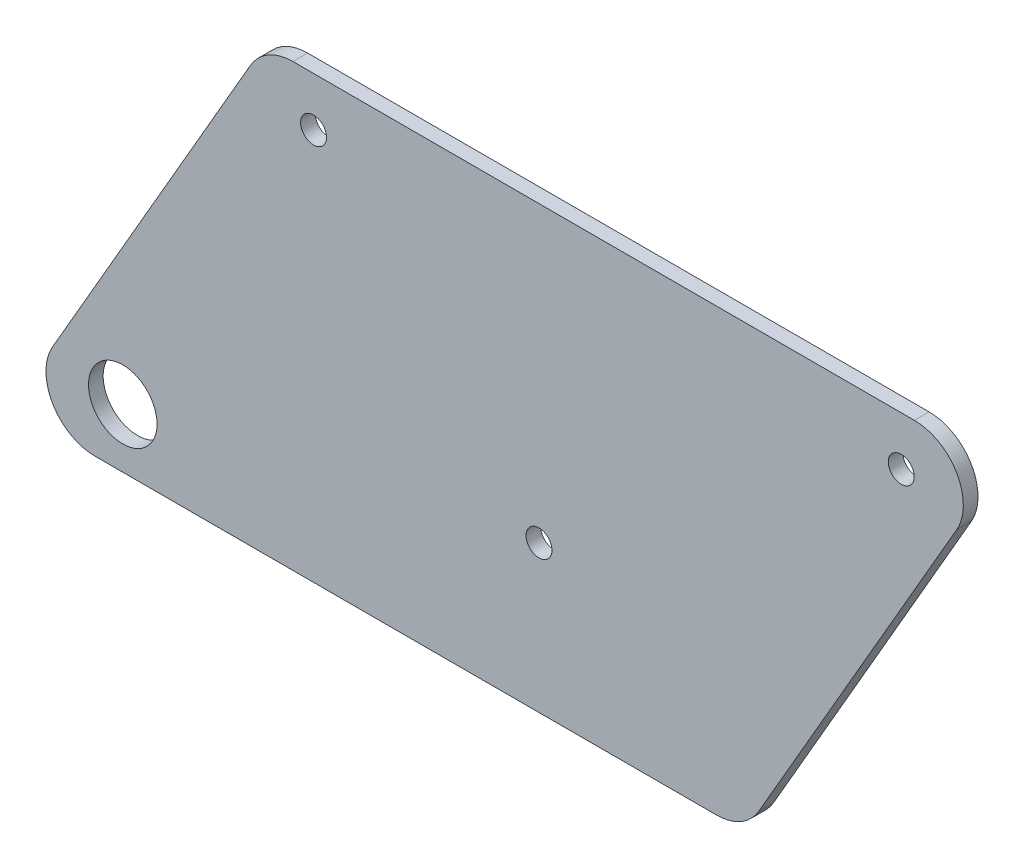
ISO-10303-21;
HEADER;
FILE_DESCRIPTION(('STEP AP214'),'2;1');
FILE_NAME('part.step','',(''),(''),'','','');
FILE_SCHEMA(('AUTOMOTIVE_DESIGN { 1 0 10303 214 1 1 1 1 }'));
ENDSEC;
DATA;
#1=APPLICATION_CONTEXT('core data for automotive mechanical design processes');
#2=APPLICATION_PROTOCOL_DEFINITION('international standard','automotive_design',2000,#1);
#3=PRODUCT_CONTEXT('',#1,'mechanical');
#4=PRODUCT('Part','Part','',(#3));
#5=PRODUCT_RELATED_PRODUCT_CATEGORY('part','',(#4));
#6=PRODUCT_DEFINITION_FORMATION('','',#4);
#7=PRODUCT_DEFINITION_CONTEXT('part definition',#1,'design');
#8=PRODUCT_DEFINITION('design','',#6,#7);
#9=PRODUCT_DEFINITION_SHAPE('','',#8);
#10=(LENGTH_UNIT() NAMED_UNIT(*) SI_UNIT(.MILLI.,.METRE.));
#11=(NAMED_UNIT(*) PLANE_ANGLE_UNIT() SI_UNIT($,.RADIAN.));
#12=(NAMED_UNIT(*) SI_UNIT($,.STERADIAN.) SOLID_ANGLE_UNIT());
#13=UNCERTAINTY_MEASURE_WITH_UNIT(LENGTH_MEASURE(1.E-05),#10,'distance_accuracy_value','');
#14=(GEOMETRIC_REPRESENTATION_CONTEXT(3) GLOBAL_UNCERTAINTY_ASSIGNED_CONTEXT((#13)) GLOBAL_UNIT_ASSIGNED_CONTEXT((#10,
#11,#12)) REPRESENTATION_CONTEXT('',''));
#15=CARTESIAN_POINT('',(0.,0.,0.));
#16=DIRECTION('',(0.,0.,1.));
#17=DIRECTION('',(1.,0.,0.));
#18=AXIS2_PLACEMENT_3D('',#15,#16,#17);
#19=CARTESIAN_POINT('',(150.,0.,3.));
#20=DIRECTION('',(0.,1.,0.));
#21=DIRECTION('',(0.,0.,1.));
#22=AXIS2_PLACEMENT_3D('',#19,#20,#21);
#23=PLANE('',#22);
#24=DIRECTION('',(1.,0.,0.));
#25=VECTOR('',#24,1.);
#26=CARTESIAN_POINT('',(150.,0.,0.));
#27=LINE('',#26,#25);
#28=CARTESIAN_POINT('',(17.3205080756889,0.,0.));
#29=VERTEX_POINT('',#28);
#30=CARTESIAN_POINT('',(144.226497308104,0.,0.));
#31=VERTEX_POINT('',#30);
#32=EDGE_CURVE('E137',#29,#31,#27,.T.);
#33=ORIENTED_EDGE('',*,*,#32,.T.);
#34=DIRECTION('',(0.,0.,-1.));
#35=VECTOR('',#34,1.);
#36=CARTESIAN_POINT('',(144.226497308104,0.,3.));
#37=LINE('',#36,#35);
#38=CARTESIAN_POINT('',(144.226497308104,0.,3.));
#39=VERTEX_POINT('',#38);
#40=EDGE_CURVE('E115',#31,#39,#37,.F.);
#41=ORIENTED_EDGE('',*,*,#40,.T.);
#42=DIRECTION('',(1.,0.,0.));
#43=VECTOR('',#42,1.);
#44=CARTESIAN_POINT('',(150.,0.,3.));
#45=LINE('',#44,#43);
#46=CARTESIAN_POINT('',(17.3205080756889,0.,3.));
#47=VERTEX_POINT('',#46);
#48=EDGE_CURVE('E147',#47,#39,#45,.T.);
#49=ORIENTED_EDGE('',*,*,#48,.F.);
#50=DIRECTION('',(0.,0.,-1.));
#51=VECTOR('',#50,1.);
#52=CARTESIAN_POINT('',(17.3205080756889,0.,3.));
#53=LINE('',#52,#51);
#54=EDGE_CURVE('E120',#47,#29,#53,.T.);
#55=ORIENTED_EDGE('',*,*,#54,.T.);
#56=EDGE_LOOP('',(#33,#41,#49,#55));
#57=FACE_BOUND('',#56,.T.);
#58=ADVANCED_FACE('F44',(#57),#23,.F.);
#59=CARTESIAN_POINT('',(201.961524227067,90.,3.));
#60=DIRECTION('',(-0.866025403784437,0.500000000000004,0.));
#61=DIRECTION('',(-0.500000000000004,-0.866025403784437,0.));
#62=AXIS2_PLACEMENT_3D('',#59,#60,#61);
#63=PLANE('',#62);
#64=DIRECTION('',(0.500000000000004,0.866025403784437,0.));
#65=VECTOR('',#64,1.);
#66=CARTESIAN_POINT('',(201.961524227067,90.,3.));
#67=LINE('',#66,#65);
#68=CARTESIAN_POINT('',(152.886751345948,4.99999999999996,3.));
#69=VERTEX_POINT('',#68);
#70=CARTESIAN_POINT('',(193.301270189222,75.,3.));
#71=VERTEX_POINT('',#70);
#72=EDGE_CURVE('E130',#69,#71,#67,.T.);
#73=ORIENTED_EDGE('',*,*,#72,.F.);
#74=DIRECTION('',(0.,0.,-1.));
#75=VECTOR('',#74,1.);
#76=CARTESIAN_POINT('',(152.886751345948,4.99999999999996,3.));
#77=LINE('',#76,#75);
#78=CARTESIAN_POINT('',(152.886751345948,4.99999999999996,0.));
#79=VERTEX_POINT('',#78);
#80=EDGE_CURVE('E114',#69,#79,#77,.T.);
#81=ORIENTED_EDGE('',*,*,#80,.T.);
#82=DIRECTION('',(0.500000000000004,0.866025403784437,0.));
#83=VECTOR('',#82,1.);
#84=CARTESIAN_POINT('',(201.961524227067,90.,0.));
#85=LINE('',#84,#83);
#86=CARTESIAN_POINT('',(193.301270189222,75.,0.));
#87=VERTEX_POINT('',#86);
#88=EDGE_CURVE('E127',#79,#87,#85,.T.);
#89=ORIENTED_EDGE('',*,*,#88,.T.);
#90=DIRECTION('',(0.,0.,-1.));
#91=VECTOR('',#90,1.);
#92=CARTESIAN_POINT('',(193.301270189222,75.,3.));
#93=LINE('',#92,#91);
#94=EDGE_CURVE('E132',#87,#71,#93,.F.);
#95=ORIENTED_EDGE('',*,*,#94,.T.);
#96=EDGE_LOOP('',(#73,#81,#89,#95));
#97=FACE_BOUND('',#96,.T.);
#98=ADVANCED_FACE('F126',(#97),#63,.F.);
#99=CARTESIAN_POINT('',(51.9615242270668,90.,3.));
#100=DIRECTION('',(0.,-1.,0.));
#101=DIRECTION('',(1.,0.,0.));
#102=AXIS2_PLACEMENT_3D('',#99,#100,#101);
#103=PLANE('',#102);
#104=DIRECTION('',(-1.,0.,0.));
#105=VECTOR('',#104,1.);
#106=CARTESIAN_POINT('',(51.9615242270668,90.,3.));
#107=LINE('',#106,#105);
#108=CARTESIAN_POINT('',(184.641016151378,90.,3.));
#109=VERTEX_POINT('',#108);
#110=CARTESIAN_POINT('',(57.7350269189631,90.,3.));
#111=VERTEX_POINT('',#110);
#112=EDGE_CURVE('E173',#109,#111,#107,.T.);
#113=ORIENTED_EDGE('',*,*,#112,.F.);
#114=DIRECTION('',(0.,0.,-1.));
#115=VECTOR('',#114,1.);
#116=CARTESIAN_POINT('',(184.641016151378,90.,3.));
#117=LINE('',#116,#115);
#118=CARTESIAN_POINT('',(184.641016151378,90.,0.));
#119=VERTEX_POINT('',#118);
#120=EDGE_CURVE('E166',#109,#119,#117,.T.);
#121=ORIENTED_EDGE('',*,*,#120,.T.);
#122=DIRECTION('',(-1.,0.,0.));
#123=VECTOR('',#122,1.);
#124=CARTESIAN_POINT('',(51.9615242270668,90.,0.));
#125=LINE('',#124,#123);
#126=CARTESIAN_POINT('',(57.7350269189631,90.,0.));
#127=VERTEX_POINT('',#126);
#128=EDGE_CURVE('E136',#119,#127,#125,.T.);
#129=ORIENTED_EDGE('',*,*,#128,.T.);
#130=DIRECTION('',(0.,0.,-1.));
#131=VECTOR('',#130,1.);
#132=CARTESIAN_POINT('',(57.7350269189631,90.,3.));
#133=LINE('',#132,#131);
#134=EDGE_CURVE('E164',#127,#111,#133,.F.);
#135=ORIENTED_EDGE('',*,*,#134,.T.);
#136=EDGE_LOOP('',(#113,#121,#129,#135));
#137=FACE_BOUND('',#136,.T.);
#138=ADVANCED_FACE('F171',(#137),#103,.F.);
#139=CARTESIAN_POINT('',(0.,0.,3.));
#140=DIRECTION('',(0.866025403784436,-0.500000000000004,0.));
#141=DIRECTION('',(0.500000000000004,0.866025403784436,0.));
#142=AXIS2_PLACEMENT_3D('',#139,#140,#141);
#143=PLANE('',#142);
#144=DIRECTION('',(-0.500000000000004,-0.866025403784436,0.));
#145=VECTOR('',#144,1.);
#146=CARTESIAN_POINT('',(0.,0.,3.));
#147=LINE('',#146,#145);
#148=CARTESIAN_POINT('',(49.0747728811187,85.,3.));
#149=VERTEX_POINT('',#148);
#150=CARTESIAN_POINT('',(8.6602540378445,15.,3.));
#151=VERTEX_POINT('',#150);
#152=EDGE_CURVE('E148',#149,#151,#147,.T.);
#153=ORIENTED_EDGE('',*,*,#152,.F.);
#154=DIRECTION('',(0.,0.,-1.));
#155=VECTOR('',#154,1.);
#156=CARTESIAN_POINT('',(49.0747728811187,85.,3.));
#157=LINE('',#156,#155);
#158=CARTESIAN_POINT('',(49.0747728811187,85.,0.));
#159=VERTEX_POINT('',#158);
#160=EDGE_CURVE('E11',#149,#159,#157,.T.);
#161=ORIENTED_EDGE('',*,*,#160,.T.);
#162=DIRECTION('',(-0.500000000000004,-0.866025403784436,0.));
#163=VECTOR('',#162,1.);
#164=CARTESIAN_POINT('',(0.,0.,0.));
#165=LINE('',#164,#163);
#166=CARTESIAN_POINT('',(8.6602540378445,15.,0.));
#167=VERTEX_POINT('',#166);
#168=EDGE_CURVE('E140',#159,#167,#165,.T.);
#169=ORIENTED_EDGE('',*,*,#168,.T.);
#170=DIRECTION('',(0.,0.,-1.));
#171=VECTOR('',#170,1.);
#172=CARTESIAN_POINT('',(8.6602540378445,15.,3.));
#173=LINE('',#172,#171);
#174=EDGE_CURVE('E52',#167,#151,#173,.F.);
#175=ORIENTED_EDGE('',*,*,#174,.T.);
#176=EDGE_LOOP('',(#153,#161,#169,#175));
#177=FACE_BOUND('',#176,.T.);
#178=ADVANCED_FACE('F180',(#177),#143,.F.);
#179=CARTESIAN_POINT('',(0.,0.,3.));
#180=DIRECTION('',(0.,0.,-1.));
#181=DIRECTION('',(-1.,0.,0.));
#182=AXIS2_PLACEMENT_3D('',#179,#180,#181);
#183=PLANE('',#182);
#184=CARTESIAN_POINT('',(23.,12.,3.));
#185=DIRECTION('',(0.,0.,1.));
#186=DIRECTION('',(1.,0.,0.));
#187=AXIS2_PLACEMENT_3D('',#184,#185,#186);
#188=CIRCLE('',#187,7.00000000000001);
#189=CARTESIAN_POINT('',(30.,12.,3.));
#190=VERTEX_POINT('',#189);
#191=EDGE_CURVE('E205',#190,#190,#188,.T.);
#192=ORIENTED_EDGE('',*,*,#191,.F.);
#193=EDGE_LOOP('',(#192));
#194=FACE_BOUND('',#193,.T.);
#195=CARTESIAN_POINT('',(108.,30.,3.));
#196=DIRECTION('',(0.,0.,1.));
#197=DIRECTION('',(1.,0.,0.));
#198=AXIS2_PLACEMENT_3D('',#195,#196,#197);
#199=CIRCLE('',#198,2.65);
#200=CARTESIAN_POINT('',(110.65,30.,3.));
#201=VERTEX_POINT('',#200);
#202=EDGE_CURVE('E202',#201,#201,#199,.T.);
#203=ORIENTED_EDGE('',*,*,#202,.F.);
#204=EDGE_LOOP('',(#203));
#205=FACE_BOUND('',#204,.T.);
#206=CARTESIAN_POINT('',(61.9615242270668,80.,3.));
#207=DIRECTION('',(0.,0.,1.));
#208=DIRECTION('',(1.,0.,0.));
#209=AXIS2_PLACEMENT_3D('',#206,#207,#208);
#210=CIRCLE('',#209,2.65000000000001);
#211=CARTESIAN_POINT('',(64.6115242270669,80.,3.));
#212=VERTEX_POINT('',#211);
#213=EDGE_CURVE('E196',#212,#212,#210,.T.);
#214=ORIENTED_EDGE('',*,*,#213,.F.);
#215=EDGE_LOOP('',(#214));
#216=FACE_BOUND('',#215,.T.);
#217=CARTESIAN_POINT('',(181.961524227067,80.,3.));
#218=DIRECTION('',(0.,0.,1.));
#219=DIRECTION('',(1.,0.,0.));
#220=AXIS2_PLACEMENT_3D('',#217,#218,#219);
#221=CIRCLE('',#220,2.65000000000001);
#222=CARTESIAN_POINT('',(184.611524227067,80.,3.));
#223=VERTEX_POINT('',#222);
#224=EDGE_CURVE('E190',#223,#223,#221,.T.);
#225=ORIENTED_EDGE('',*,*,#224,.F.);
#226=EDGE_LOOP('',(#225));
#227=FACE_BOUND('',#226,.T.);
#228=ORIENTED_EDGE('',*,*,#48,.T.);
#229=CARTESIAN_POINT('',(144.226497308104,9.99999999999999,3.));
#230=DIRECTION('',(0.,0.,-1.));
#231=DIRECTION('',(-1.,0.,0.));
#232=AXIS2_PLACEMENT_3D('',#229,#230,#231);
#233=CIRCLE('',#232,10.);
#234=EDGE_CURVE('E162',#39,#69,#233,.F.);
#235=ORIENTED_EDGE('',*,*,#234,.T.);
#236=ORIENTED_EDGE('',*,*,#72,.T.);
#237=CARTESIAN_POINT('',(184.641016151378,80.,3.));
#238=DIRECTION('',(0.,0.,-1.));
#239=DIRECTION('',(-1.,0.,0.));
#240=AXIS2_PLACEMENT_3D('',#237,#238,#239);
#241=CIRCLE('',#240,10.);
#242=EDGE_CURVE('E160',#71,#109,#241,.F.);
#243=ORIENTED_EDGE('',*,*,#242,.T.);
#244=ORIENTED_EDGE('',*,*,#112,.T.);
#245=CARTESIAN_POINT('',(57.7350269189631,80.,3.));
#246=DIRECTION('',(0.,0.,-1.));
#247=DIRECTION('',(-1.,0.,0.));
#248=AXIS2_PLACEMENT_3D('',#245,#246,#247);
#249=CIRCLE('',#248,10.);
#250=EDGE_CURVE('E65',#111,#149,#249,.F.);
#251=ORIENTED_EDGE('',*,*,#250,.T.);
#252=ORIENTED_EDGE('',*,*,#152,.T.);
#253=CARTESIAN_POINT('',(17.3205080756889,10.,3.));
#254=DIRECTION('',(0.,0.,-1.));
#255=DIRECTION('',(-1.,0.,0.));
#256=AXIS2_PLACEMENT_3D('',#253,#254,#255);
#257=CIRCLE('',#256,10.);
#258=EDGE_CURVE('E157',#151,#47,#257,.F.);
#259=ORIENTED_EDGE('',*,*,#258,.T.);
#260=EDGE_LOOP('',(#228,#235,#236,#243,#244,#251,#252,#259));
#261=FACE_BOUND('',#260,.T.);
#262=ADVANCED_FACE('F220',(#194,#205,#216,#227,#261),#183,.F.);
#263=CARTESIAN_POINT('',(0.,0.,0.));
#264=DIRECTION('',(0.,0.,-1.));
#265=DIRECTION('',(-1.,0.,0.));
#266=AXIS2_PLACEMENT_3D('',#263,#264,#265);
#267=PLANE('',#266);
#268=CARTESIAN_POINT('',(23.,12.,0.));
#269=DIRECTION('',(0.,0.,1.));
#270=DIRECTION('',(1.,0.,0.));
#271=AXIS2_PLACEMENT_3D('',#268,#269,#270);
#272=CIRCLE('',#271,7.00000000000001);
#273=CARTESIAN_POINT('',(30.,12.,0.));
#274=VERTEX_POINT('',#273);
#275=EDGE_CURVE('E142',#274,#274,#272,.T.);
#276=ORIENTED_EDGE('',*,*,#275,.T.);
#277=EDGE_LOOP('',(#276));
#278=FACE_BOUND('',#277,.T.);
#279=CARTESIAN_POINT('',(108.,30.,0.));
#280=DIRECTION('',(0.,0.,1.));
#281=DIRECTION('',(1.,0.,0.));
#282=AXIS2_PLACEMENT_3D('',#279,#280,#281);
#283=CIRCLE('',#282,2.65);
#284=CARTESIAN_POINT('',(110.65,30.,0.));
#285=VERTEX_POINT('',#284);
#286=EDGE_CURVE('E199',#285,#285,#283,.T.);
#287=ORIENTED_EDGE('',*,*,#286,.T.);
#288=EDGE_LOOP('',(#287));
#289=FACE_BOUND('',#288,.T.);
#290=CARTESIAN_POINT('',(61.9615242270668,80.,0.));
#291=DIRECTION('',(0.,0.,1.));
#292=DIRECTION('',(1.,0.,0.));
#293=AXIS2_PLACEMENT_3D('',#290,#291,#292);
#294=CIRCLE('',#293,2.65000000000001);
#295=CARTESIAN_POINT('',(64.6115242270669,80.,0.));
#296=VERTEX_POINT('',#295);
#297=EDGE_CURVE('E193',#296,#296,#294,.T.);
#298=ORIENTED_EDGE('',*,*,#297,.T.);
#299=EDGE_LOOP('',(#298));
#300=FACE_BOUND('',#299,.T.);
#301=CARTESIAN_POINT('',(181.961524227067,80.,0.));
#302=DIRECTION('',(0.,0.,1.));
#303=DIRECTION('',(1.,0.,0.));
#304=AXIS2_PLACEMENT_3D('',#301,#302,#303);
#305=CIRCLE('',#304,2.65000000000001);
#306=CARTESIAN_POINT('',(184.611524227067,80.,0.));
#307=VERTEX_POINT('',#306);
#308=EDGE_CURVE('E187',#307,#307,#305,.T.);
#309=ORIENTED_EDGE('',*,*,#308,.T.);
#310=EDGE_LOOP('',(#309));
#311=FACE_BOUND('',#310,.T.);
#312=ORIENTED_EDGE('',*,*,#88,.F.);
#313=CARTESIAN_POINT('',(144.226497308104,9.99999999999999,0.));
#314=DIRECTION('',(0.,0.,-1.));
#315=DIRECTION('',(-1.,0.,0.));
#316=AXIS2_PLACEMENT_3D('',#313,#314,#315);
#317=CIRCLE('',#316,10.);
#318=EDGE_CURVE('E110',#79,#31,#317,.T.);
#319=ORIENTED_EDGE('',*,*,#318,.T.);
#320=ORIENTED_EDGE('',*,*,#32,.F.);
#321=CARTESIAN_POINT('',(17.3205080756889,10.,0.));
#322=DIRECTION('',(0.,0.,-1.));
#323=DIRECTION('',(-1.,0.,0.));
#324=AXIS2_PLACEMENT_3D('',#321,#322,#323);
#325=CIRCLE('',#324,10.);
#326=EDGE_CURVE('E131',#29,#167,#325,.T.);
#327=ORIENTED_EDGE('',*,*,#326,.T.);
#328=ORIENTED_EDGE('',*,*,#168,.F.);
#329=CARTESIAN_POINT('',(57.7350269189631,80.,0.));
#330=DIRECTION('',(0.,0.,-1.));
#331=DIRECTION('',(-1.,0.,0.));
#332=AXIS2_PLACEMENT_3D('',#329,#330,#331);
#333=CIRCLE('',#332,10.);
#334=EDGE_CURVE('E151',#159,#127,#333,.T.);
#335=ORIENTED_EDGE('',*,*,#334,.T.);
#336=ORIENTED_EDGE('',*,*,#128,.F.);
#337=CARTESIAN_POINT('',(184.641016151378,80.,0.));
#338=DIRECTION('',(0.,0.,-1.));
#339=DIRECTION('',(-1.,0.,0.));
#340=AXIS2_PLACEMENT_3D('',#337,#338,#339);
#341=CIRCLE('',#340,10.);
#342=EDGE_CURVE('E121',#119,#87,#341,.T.);
#343=ORIENTED_EDGE('',*,*,#342,.T.);
#344=EDGE_LOOP('',(#312,#319,#320,#327,#328,#335,#336,#343));
#345=FACE_BOUND('',#344,.T.);
#346=ADVANCED_FACE('F134',(#278,#289,#300,#311,#345),#267,.T.);
#347=CARTESIAN_POINT('',(181.961524227067,80.,0.));
#348=DIRECTION('',(0.,0.,1.));
#349=DIRECTION('',(1.,0.,0.));
#350=AXIS2_PLACEMENT_3D('',#347,#348,#349);
#351=CYLINDRICAL_SURFACE('',#350,2.65000000000001);
#352=ORIENTED_EDGE('',*,*,#308,.F.);
#353=EDGE_LOOP('',(#352));
#354=FACE_BOUND('',#353,.T.);
#355=ORIENTED_EDGE('',*,*,#224,.T.);
#356=EDGE_LOOP('',(#355));
#357=FACE_BOUND('',#356,.T.);
#358=ADVANCED_FACE('F291',(#354,#357),#351,.F.);
#359=CARTESIAN_POINT('',(61.9615242270668,80.,0.));
#360=DIRECTION('',(0.,0.,1.));
#361=DIRECTION('',(1.,0.,0.));
#362=AXIS2_PLACEMENT_3D('',#359,#360,#361);
#363=CYLINDRICAL_SURFACE('',#362,2.65000000000001);
#364=ORIENTED_EDGE('',*,*,#297,.F.);
#365=EDGE_LOOP('',(#364));
#366=FACE_BOUND('',#365,.T.);
#367=ORIENTED_EDGE('',*,*,#213,.T.);
#368=EDGE_LOOP('',(#367));
#369=FACE_BOUND('',#368,.T.);
#370=ADVANCED_FACE('F282',(#366,#369),#363,.F.);
#371=CARTESIAN_POINT('',(108.,30.,0.));
#372=DIRECTION('',(0.,0.,1.));
#373=DIRECTION('',(1.,0.,0.));
#374=AXIS2_PLACEMENT_3D('',#371,#372,#373);
#375=CYLINDRICAL_SURFACE('',#374,2.65);
#376=ORIENTED_EDGE('',*,*,#286,.F.);
#377=EDGE_LOOP('',(#376));
#378=FACE_BOUND('',#377,.T.);
#379=ORIENTED_EDGE('',*,*,#202,.T.);
#380=EDGE_LOOP('',(#379));
#381=FACE_BOUND('',#380,.T.);
#382=ADVANCED_FACE('F216',(#378,#381),#375,.F.);
#383=CARTESIAN_POINT('',(23.,12.,0.));
#384=DIRECTION('',(0.,0.,1.));
#385=DIRECTION('',(1.,0.,0.));
#386=AXIS2_PLACEMENT_3D('',#383,#384,#385);
#387=CYLINDRICAL_SURFACE('',#386,7.00000000000001);
#388=ORIENTED_EDGE('',*,*,#275,.F.);
#389=EDGE_LOOP('',(#388));
#390=FACE_BOUND('',#389,.T.);
#391=ORIENTED_EDGE('',*,*,#191,.T.);
#392=EDGE_LOOP('',(#391));
#393=FACE_BOUND('',#392,.T.);
#394=ADVANCED_FACE('F213',(#390,#393),#387,.F.);
#395=CARTESIAN_POINT('',(144.226497308104,9.99999999999999,3.));
#396=DIRECTION('',(0.,0.,-1.));
#397=DIRECTION('',(-1.,0.,0.));
#398=AXIS2_PLACEMENT_3D('',#395,#396,#397);
#399=CYLINDRICAL_SURFACE('',#398,10.);
#400=ORIENTED_EDGE('',*,*,#234,.F.);
#401=ORIENTED_EDGE('',*,*,#40,.F.);
#402=ORIENTED_EDGE('',*,*,#318,.F.);
#403=ORIENTED_EDGE('',*,*,#80,.F.);
#404=EDGE_LOOP('',(#400,#401,#402,#403));
#405=FACE_BOUND('',#404,.T.);
#406=ADVANCED_FACE('F113',(#405),#399,.T.);
#407=CARTESIAN_POINT('',(184.641016151378,80.,3.));
#408=DIRECTION('',(0.,0.,-1.));
#409=DIRECTION('',(-1.,0.,0.));
#410=AXIS2_PLACEMENT_3D('',#407,#408,#409);
#411=CYLINDRICAL_SURFACE('',#410,10.);
#412=ORIENTED_EDGE('',*,*,#242,.F.);
#413=ORIENTED_EDGE('',*,*,#94,.F.);
#414=ORIENTED_EDGE('',*,*,#342,.F.);
#415=ORIENTED_EDGE('',*,*,#120,.F.);
#416=EDGE_LOOP('',(#412,#413,#414,#415));
#417=FACE_BOUND('',#416,.T.);
#418=ADVANCED_FACE('F237',(#417),#411,.T.);
#419=CARTESIAN_POINT('',(57.7350269189631,80.,3.));
#420=DIRECTION('',(0.,0.,-1.));
#421=DIRECTION('',(-1.,0.,0.));
#422=AXIS2_PLACEMENT_3D('',#419,#420,#421);
#423=CYLINDRICAL_SURFACE('',#422,10.);
#424=ORIENTED_EDGE('',*,*,#250,.F.);
#425=ORIENTED_EDGE('',*,*,#134,.F.);
#426=ORIENTED_EDGE('',*,*,#334,.F.);
#427=ORIENTED_EDGE('',*,*,#160,.F.);
#428=EDGE_LOOP('',(#424,#425,#426,#427));
#429=FACE_BOUND('',#428,.T.);
#430=ADVANCED_FACE('F179',(#429),#423,.T.);
#431=CARTESIAN_POINT('',(17.3205080756889,10.,3.));
#432=DIRECTION('',(0.,0.,-1.));
#433=DIRECTION('',(-1.,0.,0.));
#434=AXIS2_PLACEMENT_3D('',#431,#432,#433);
#435=CYLINDRICAL_SURFACE('',#434,10.);
#436=ORIENTED_EDGE('',*,*,#258,.F.);
#437=ORIENTED_EDGE('',*,*,#174,.F.);
#438=ORIENTED_EDGE('',*,*,#326,.F.);
#439=ORIENTED_EDGE('',*,*,#54,.F.);
#440=EDGE_LOOP('',(#436,#437,#438,#439));
#441=FACE_BOUND('',#440,.T.);
#442=ADVANCED_FACE('F46',(#441),#435,.T.);
#443=CLOSED_SHELL('',(#58,#98,#138,#178,#262,#346,#358,#370,#382,#394,#406,#418,#430,#442));
#444=MANIFOLD_SOLID_BREP('B2',#443);
#445=ADVANCED_BREP_SHAPE_REPRESENTATION('',(#18,#444),#14);
#446=SHAPE_DEFINITION_REPRESENTATION(#9,#445);
ENDSEC;
END-ISO-10303-21;
